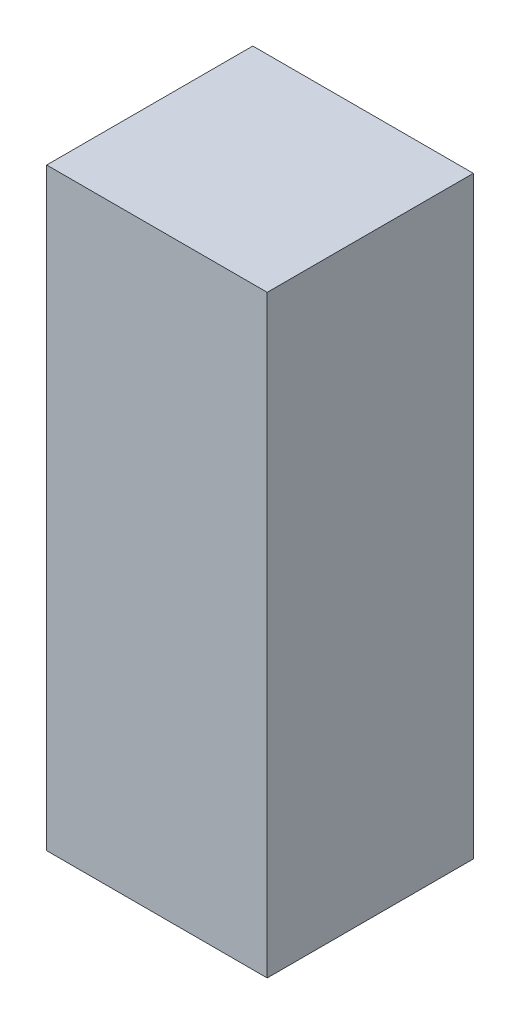
ISO-10303-21;
HEADER;
FILE_DESCRIPTION(('STEP AP214'),'2;1');
FILE_NAME('part.step','',(''),(''),'','','');
FILE_SCHEMA(('AUTOMOTIVE_DESIGN { 1 0 10303 214 1 1 1 1 }'));
ENDSEC;
DATA;
#1=APPLICATION_CONTEXT('core data for automotive mechanical design processes');
#2=APPLICATION_PROTOCOL_DEFINITION('international standard','automotive_design',2000,#1);
#3=PRODUCT_CONTEXT('',#1,'mechanical');
#4=PRODUCT('Part','Part','',(#3));
#5=PRODUCT_RELATED_PRODUCT_CATEGORY('part','',(#4));
#6=PRODUCT_DEFINITION_FORMATION('','',#4);
#7=PRODUCT_DEFINITION_CONTEXT('part definition',#1,'design');
#8=PRODUCT_DEFINITION('design','',#6,#7);
#9=PRODUCT_DEFINITION_SHAPE('','',#8);
#10=(LENGTH_UNIT() NAMED_UNIT(*) SI_UNIT(.MILLI.,.METRE.));
#11=(NAMED_UNIT(*) PLANE_ANGLE_UNIT() SI_UNIT($,.RADIAN.));
#12=(NAMED_UNIT(*) SI_UNIT($,.STERADIAN.) SOLID_ANGLE_UNIT());
#13=UNCERTAINTY_MEASURE_WITH_UNIT(LENGTH_MEASURE(1.E-05),#10,'distance_accuracy_value','');
#14=(GEOMETRIC_REPRESENTATION_CONTEXT(3) GLOBAL_UNCERTAINTY_ASSIGNED_CONTEXT((#13)) GLOBAL_UNIT_ASSIGNED_CONTEXT((#10,
#11,#12)) REPRESENTATION_CONTEXT('',''));
#15=CARTESIAN_POINT('',(0.,0.,0.));
#16=DIRECTION('',(0.,0.,1.));
#17=DIRECTION('',(1.,0.,0.));
#18=AXIS2_PLACEMENT_3D('',#15,#16,#17);
#19=CARTESIAN_POINT('',(10.25,-55.2,9.58));
#20=DIRECTION('',(1.,0.,0.));
#21=DIRECTION('',(0.,0.,-1.));
#22=AXIS2_PLACEMENT_3D('',#19,#20,#21);
#23=PLANE('',#22);
#24=DIRECTION('',(0.,0.,-1.));
#25=VECTOR('',#24,1.);
#26=CARTESIAN_POINT('',(10.25,0.,9.58));
#27=LINE('',#26,#25);
#28=CARTESIAN_POINT('',(10.25,0.,9.58));
#29=VERTEX_POINT('',#28);
#30=CARTESIAN_POINT('',(10.25,0.,-9.58));
#31=VERTEX_POINT('',#30);
#32=EDGE_CURVE('E105',#29,#31,#27,.T.);
#33=ORIENTED_EDGE('',*,*,#32,.F.);
#34=DIRECTION('',(0.,1.,0.));
#35=VECTOR('',#34,1.);
#36=CARTESIAN_POINT('',(10.25,-55.2,9.58));
#37=LINE('',#36,#35);
#38=CARTESIAN_POINT('',(10.25,-55.2,9.58));
#39=VERTEX_POINT('',#38);
#40=EDGE_CURVE('E11',#39,#29,#37,.T.);
#41=ORIENTED_EDGE('',*,*,#40,.F.);
#42=DIRECTION('',(0.,0.,-1.));
#43=VECTOR('',#42,1.);
#44=CARTESIAN_POINT('',(10.25,-55.2,9.58));
#45=LINE('',#44,#43);
#46=CARTESIAN_POINT('',(10.25,-55.2,-9.58));
#47=VERTEX_POINT('',#46);
#48=EDGE_CURVE('E99',#39,#47,#45,.T.);
#49=ORIENTED_EDGE('',*,*,#48,.T.);
#50=DIRECTION('',(0.,1.,0.));
#51=VECTOR('',#50,1.);
#52=CARTESIAN_POINT('',(10.25,-55.2,-9.58));
#53=LINE('',#52,#51);
#54=EDGE_CURVE('E44',#47,#31,#53,.T.);
#55=ORIENTED_EDGE('',*,*,#54,.T.);
#56=EDGE_LOOP('',(#33,#41,#49,#55));
#57=FACE_BOUND('',#56,.T.);
#58=ADVANCED_FACE('F41',(#57),#23,.T.);
#59=CARTESIAN_POINT('',(-10.25,-55.2,9.58));
#60=DIRECTION('',(0.,0.,1.));
#61=DIRECTION('',(1.,0.,0.));
#62=AXIS2_PLACEMENT_3D('',#59,#60,#61);
#63=PLANE('',#62);
#64=DIRECTION('',(1.,0.,0.));
#65=VECTOR('',#64,1.);
#66=CARTESIAN_POINT('',(-10.25,0.,9.58));
#67=LINE('',#66,#65);
#68=CARTESIAN_POINT('',(-10.25,0.,9.58));
#69=VERTEX_POINT('',#68);
#70=EDGE_CURVE('E101',#69,#29,#67,.T.);
#71=ORIENTED_EDGE('',*,*,#70,.F.);
#72=DIRECTION('',(0.,1.,0.));
#73=VECTOR('',#72,1.);
#74=CARTESIAN_POINT('',(-10.25,-55.2,9.58));
#75=LINE('',#74,#73);
#76=CARTESIAN_POINT('',(-10.25,-55.2,9.58));
#77=VERTEX_POINT('',#76);
#78=EDGE_CURVE('E50',#77,#69,#75,.T.);
#79=ORIENTED_EDGE('',*,*,#78,.F.);
#80=DIRECTION('',(1.,0.,0.));
#81=VECTOR('',#80,1.);
#82=CARTESIAN_POINT('',(-10.25,-55.2,9.58));
#83=LINE('',#82,#81);
#84=EDGE_CURVE('E96',#77,#39,#83,.T.);
#85=ORIENTED_EDGE('',*,*,#84,.T.);
#86=ORIENTED_EDGE('',*,*,#40,.T.);
#87=EDGE_LOOP('',(#71,#79,#85,#86));
#88=FACE_BOUND('',#87,.T.);
#89=ADVANCED_FACE('F115',(#88),#63,.T.);
#90=CARTESIAN_POINT('',(-10.25,-55.2,9.58));
#91=DIRECTION('',(-1.,0.,0.));
#92=DIRECTION('',(0.,0.,1.));
#93=AXIS2_PLACEMENT_3D('',#90,#91,#92);
#94=PLANE('',#93);
#95=DIRECTION('',(0.,0.,1.));
#96=VECTOR('',#95,1.);
#97=CARTESIAN_POINT('',(-10.25,0.,9.58));
#98=LINE('',#97,#96);
#99=CARTESIAN_POINT('',(-10.25,0.,-9.58));
#100=VERTEX_POINT('',#99);
#101=EDGE_CURVE('E91',#100,#69,#98,.T.);
#102=ORIENTED_EDGE('',*,*,#101,.F.);
#103=DIRECTION('',(0.,1.,0.));
#104=VECTOR('',#103,1.);
#105=CARTESIAN_POINT('',(-10.25,-55.2,-9.58));
#106=LINE('',#105,#104);
#107=CARTESIAN_POINT('',(-10.25,-55.2,-9.58));
#108=VERTEX_POINT('',#107);
#109=EDGE_CURVE('E86',#108,#100,#106,.T.);
#110=ORIENTED_EDGE('',*,*,#109,.F.);
#111=DIRECTION('',(0.,0.,1.));
#112=VECTOR('',#111,1.);
#113=CARTESIAN_POINT('',(-10.25,-55.2,9.58));
#114=LINE('',#113,#112);
#115=EDGE_CURVE('E89',#108,#77,#114,.T.);
#116=ORIENTED_EDGE('',*,*,#115,.T.);
#117=ORIENTED_EDGE('',*,*,#78,.T.);
#118=EDGE_LOOP('',(#102,#110,#116,#117));
#119=FACE_BOUND('',#118,.T.);
#120=ADVANCED_FACE('F88',(#119),#94,.T.);
#121=CARTESIAN_POINT('',(-10.25,-55.2,-9.58));
#122=DIRECTION('',(0.,0.,-1.));
#123=DIRECTION('',(-1.,0.,0.));
#124=AXIS2_PLACEMENT_3D('',#121,#122,#123);
#125=PLANE('',#124);
#126=DIRECTION('',(-1.,0.,0.));
#127=VECTOR('',#126,1.);
#128=CARTESIAN_POINT('',(-10.25,0.,-9.58));
#129=LINE('',#128,#127);
#130=EDGE_CURVE('E108',#31,#100,#129,.T.);
#131=ORIENTED_EDGE('',*,*,#130,.F.);
#132=ORIENTED_EDGE('',*,*,#54,.F.);
#133=DIRECTION('',(-1.,0.,0.));
#134=VECTOR('',#133,1.);
#135=CARTESIAN_POINT('',(-10.25,-55.2,-9.58));
#136=LINE('',#135,#134);
#137=EDGE_CURVE('E95',#47,#108,#136,.T.);
#138=ORIENTED_EDGE('',*,*,#137,.T.);
#139=ORIENTED_EDGE('',*,*,#109,.T.);
#140=EDGE_LOOP('',(#131,#132,#138,#139));
#141=FACE_BOUND('',#140,.T.);
#142=ADVANCED_FACE('F98',(#141),#125,.T.);
#143=CARTESIAN_POINT('',(0.,-55.2,0.));
#144=DIRECTION('',(0.,-1.,0.));
#145=DIRECTION('',(0.,0.,-1.));
#146=AXIS2_PLACEMENT_3D('',#143,#144,#145);
#147=PLANE('',#146);
#148=ORIENTED_EDGE('',*,*,#48,.F.);
#149=ORIENTED_EDGE('',*,*,#84,.F.);
#150=ORIENTED_EDGE('',*,*,#115,.F.);
#151=ORIENTED_EDGE('',*,*,#137,.F.);
#152=EDGE_LOOP('',(#148,#149,#150,#151));
#153=FACE_BOUND('',#152,.T.);
#154=ADVANCED_FACE('F94',(#153),#147,.T.);
#155=CARTESIAN_POINT('',(0.,0.,0.));
#156=DIRECTION('',(0.,-1.,0.));
#157=DIRECTION('',(0.,0.,-1.));
#158=AXIS2_PLACEMENT_3D('',#155,#156,#157);
#159=PLANE('',#158);
#160=ORIENTED_EDGE('',*,*,#32,.T.);
#161=ORIENTED_EDGE('',*,*,#130,.T.);
#162=ORIENTED_EDGE('',*,*,#101,.T.);
#163=ORIENTED_EDGE('',*,*,#70,.T.);
#164=EDGE_LOOP('',(#160,#161,#162,#163));
#165=FACE_BOUND('',#164,.T.);
#166=ADVANCED_FACE('F114',(#165),#159,.F.);
#167=CLOSED_SHELL('',(#58,#89,#120,#142,#154,#166));
#168=MANIFOLD_SOLID_BREP('B2',#167);
#169=ADVANCED_BREP_SHAPE_REPRESENTATION('',(#18,#168),#14);
#170=SHAPE_DEFINITION_REPRESENTATION(#9,#169);
ENDSEC;
END-ISO-10303-21;
